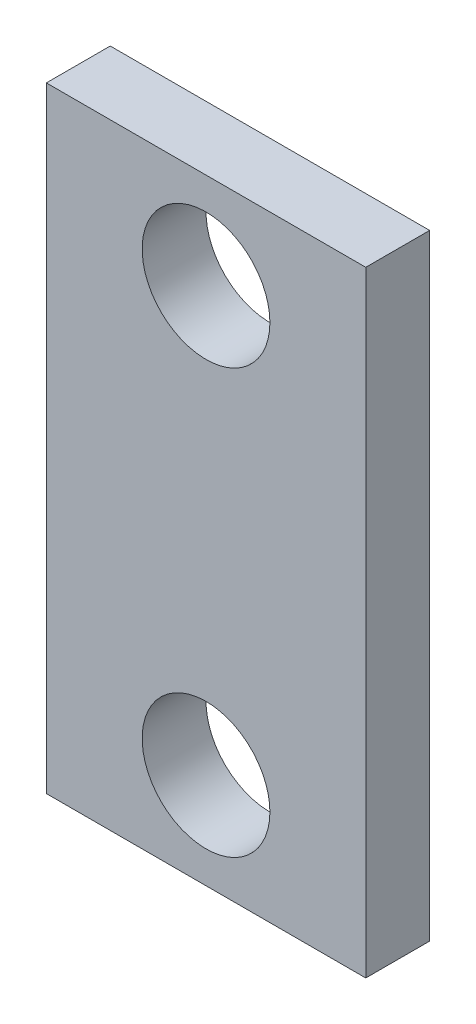
ISO-10303-21;
HEADER;
FILE_DESCRIPTION(('STEP AP214'),'2;1');
FILE_NAME('part.step','',(''),(''),'','','');
FILE_SCHEMA(('AUTOMOTIVE_DESIGN { 1 0 10303 214 1 1 1 1 }'));
ENDSEC;
DATA;
#1=APPLICATION_CONTEXT('core data for automotive mechanical design processes');
#2=APPLICATION_PROTOCOL_DEFINITION('international standard','automotive_design',2000,#1);
#3=PRODUCT_CONTEXT('',#1,'mechanical');
#4=PRODUCT('Part','Part','',(#3));
#5=PRODUCT_RELATED_PRODUCT_CATEGORY('part','',(#4));
#6=PRODUCT_DEFINITION_FORMATION('','',#4);
#7=PRODUCT_DEFINITION_CONTEXT('part definition',#1,'design');
#8=PRODUCT_DEFINITION('design','',#6,#7);
#9=PRODUCT_DEFINITION_SHAPE('','',#8);
#10=(LENGTH_UNIT() NAMED_UNIT(*) SI_UNIT(.MILLI.,.METRE.));
#11=(NAMED_UNIT(*) PLANE_ANGLE_UNIT() SI_UNIT($,.RADIAN.));
#12=(NAMED_UNIT(*) SI_UNIT($,.STERADIAN.) SOLID_ANGLE_UNIT());
#13=UNCERTAINTY_MEASURE_WITH_UNIT(LENGTH_MEASURE(1.E-05),#10,'distance_accuracy_value','');
#14=(GEOMETRIC_REPRESENTATION_CONTEXT(3) GLOBAL_UNCERTAINTY_ASSIGNED_CONTEXT((#13)) GLOBAL_UNIT_ASSIGNED_CONTEXT((#10,
#11,#12)) REPRESENTATION_CONTEXT('',''));
#15=CARTESIAN_POINT('',(0.,0.,0.));
#16=DIRECTION('',(0.,0.,1.));
#17=DIRECTION('',(1.,0.,0.));
#18=AXIS2_PLACEMENT_3D('',#15,#16,#17);
#19=CARTESIAN_POINT('',(0.,0.,2.));
#20=DIRECTION('',(0.,0.,-1.));
#21=DIRECTION('',(-1.,0.,0.));
#22=AXIS2_PLACEMENT_3D('',#19,#20,#21);
#23=PLANE('',#22);
#24=DIRECTION('',(1.,0.,0.));
#25=VECTOR('',#24,1.);
#26=CARTESIAN_POINT('',(10.,0.,2.));
#27=LINE('',#26,#25);
#28=CARTESIAN_POINT('',(0.,0.,2.));
#29=VERTEX_POINT('',#28);
#30=CARTESIAN_POINT('',(10.,0.,2.));
#31=VERTEX_POINT('',#30);
#32=EDGE_CURVE('E98',#29,#31,#27,.T.);
#33=ORIENTED_EDGE('',*,*,#32,.T.);
#34=DIRECTION('',(0.,1.,0.));
#35=VECTOR('',#34,1.);
#36=CARTESIAN_POINT('',(10.,19.27,2.));
#37=LINE('',#36,#35);
#38=CARTESIAN_POINT('',(10.,19.27,2.));
#39=VERTEX_POINT('',#38);
#40=EDGE_CURVE('E93',#31,#39,#37,.T.);
#41=ORIENTED_EDGE('',*,*,#40,.T.);
#42=DIRECTION('',(-1.,0.,0.));
#43=VECTOR('',#42,1.);
#44=CARTESIAN_POINT('',(0.,19.27,2.));
#45=LINE('',#44,#43);
#46=CARTESIAN_POINT('',(0.,19.27,2.));
#47=VERTEX_POINT('',#46);
#48=EDGE_CURVE('E96',#39,#47,#45,.T.);
#49=ORIENTED_EDGE('',*,*,#48,.T.);
#50=DIRECTION('',(0.,-1.,0.));
#51=VECTOR('',#50,1.);
#52=CARTESIAN_POINT('',(0.,0.,2.));
#53=LINE('',#52,#51);
#54=EDGE_CURVE('E63',#47,#29,#53,.T.);
#55=ORIENTED_EDGE('',*,*,#54,.T.);
#56=EDGE_LOOP('',(#33,#41,#49,#55));
#57=FACE_BOUND('',#56,.T.);
#58=CARTESIAN_POINT('',(4.99907778331021,16.27,2.));
#59=DIRECTION('',(0.,0.,1.));
#60=DIRECTION('',(1.,0.,0.));
#61=AXIS2_PLACEMENT_3D('',#58,#59,#60);
#62=CIRCLE('',#61,2.);
#63=CARTESIAN_POINT('',(6.99907778331021,16.27,2.));
#64=VERTEX_POINT('',#63);
#65=EDGE_CURVE('E118',#64,#64,#62,.T.);
#66=ORIENTED_EDGE('',*,*,#65,.F.);
#67=EDGE_LOOP('',(#66));
#68=FACE_BOUND('',#67,.T.);
#69=CARTESIAN_POINT('',(4.99907778331021,3.,2.));
#70=DIRECTION('',(0.,0.,1.));
#71=DIRECTION('',(1.,0.,0.));
#72=AXIS2_PLACEMENT_3D('',#69,#70,#71);
#73=CIRCLE('',#72,2.);
#74=CARTESIAN_POINT('',(6.99907778331021,3.,2.));
#75=VERTEX_POINT('',#74);
#76=EDGE_CURVE('E140',#75,#75,#73,.T.);
#77=ORIENTED_EDGE('',*,*,#76,.F.);
#78=EDGE_LOOP('',(#77));
#79=FACE_BOUND('',#78,.T.);
#80=ADVANCED_FACE('F45',(#57,#68,#79),#23,.F.);
#81=CARTESIAN_POINT('',(0.,0.,0.));
#82=DIRECTION('',(0.,0.,-1.));
#83=DIRECTION('',(-1.,0.,0.));
#84=AXIS2_PLACEMENT_3D('',#81,#82,#83);
#85=PLANE('',#84);
#86=CARTESIAN_POINT('',(4.99907778331021,16.27,0.));
#87=DIRECTION('',(0.,0.,1.));
#88=DIRECTION('',(1.,0.,0.));
#89=AXIS2_PLACEMENT_3D('',#86,#87,#88);
#90=CIRCLE('',#89,2.);
#91=CARTESIAN_POINT('',(6.99907778331021,16.27,0.));
#92=VERTEX_POINT('',#91);
#93=EDGE_CURVE('E136',#92,#92,#90,.T.);
#94=ORIENTED_EDGE('',*,*,#93,.T.);
#95=EDGE_LOOP('',(#94));
#96=FACE_BOUND('',#95,.T.);
#97=DIRECTION('',(1.,0.,0.));
#98=VECTOR('',#97,1.);
#99=CARTESIAN_POINT('',(10.,0.,0.));
#100=LINE('',#99,#98);
#101=CARTESIAN_POINT('',(0.,0.,0.));
#102=VERTEX_POINT('',#101);
#103=CARTESIAN_POINT('',(10.,0.,0.));
#104=VERTEX_POINT('',#103);
#105=EDGE_CURVE('E114',#102,#104,#100,.T.);
#106=ORIENTED_EDGE('',*,*,#105,.F.);
#107=DIRECTION('',(0.,-1.,0.));
#108=VECTOR('',#107,1.);
#109=CARTESIAN_POINT('',(0.,0.,0.));
#110=LINE('',#109,#108);
#111=CARTESIAN_POINT('',(0.,19.27,0.));
#112=VERTEX_POINT('',#111);
#113=EDGE_CURVE('E86',#112,#102,#110,.T.);
#114=ORIENTED_EDGE('',*,*,#113,.F.);
#115=DIRECTION('',(-1.,0.,0.));
#116=VECTOR('',#115,1.);
#117=CARTESIAN_POINT('',(0.,19.27,0.));
#118=LINE('',#117,#116);
#119=CARTESIAN_POINT('',(10.,19.27,0.));
#120=VERTEX_POINT('',#119);
#121=EDGE_CURVE('E80',#120,#112,#118,.T.);
#122=ORIENTED_EDGE('',*,*,#121,.F.);
#123=DIRECTION('',(0.,1.,0.));
#124=VECTOR('',#123,1.);
#125=CARTESIAN_POINT('',(10.,19.27,0.));
#126=LINE('',#125,#124);
#127=EDGE_CURVE('E103',#104,#120,#126,.T.);
#128=ORIENTED_EDGE('',*,*,#127,.F.);
#129=EDGE_LOOP('',(#106,#114,#122,#128));
#130=FACE_BOUND('',#129,.T.);
#131=CARTESIAN_POINT('',(4.99907778331021,3.,0.));
#132=DIRECTION('',(0.,0.,1.));
#133=DIRECTION('',(1.,0.,0.));
#134=AXIS2_PLACEMENT_3D('',#131,#132,#133);
#135=CIRCLE('',#134,2.);
#136=CARTESIAN_POINT('',(6.99907778331021,3.,0.));
#137=VERTEX_POINT('',#136);
#138=EDGE_CURVE('E144',#137,#137,#135,.T.);
#139=ORIENTED_EDGE('',*,*,#138,.T.);
#140=EDGE_LOOP('',(#139));
#141=FACE_BOUND('',#140,.T.);
#142=ADVANCED_FACE('F131',(#96,#130,#141),#85,.T.);
#143=CARTESIAN_POINT('',(10.,0.,2.));
#144=DIRECTION('',(0.,1.,0.));
#145=DIRECTION('',(-1.,0.,0.));
#146=AXIS2_PLACEMENT_3D('',#143,#144,#145);
#147=PLANE('',#146);
#148=ORIENTED_EDGE('',*,*,#105,.T.);
#149=DIRECTION('',(0.,0.,-1.));
#150=VECTOR('',#149,1.);
#151=CARTESIAN_POINT('',(10.,0.,2.));
#152=LINE('',#151,#150);
#153=EDGE_CURVE('E11',#31,#104,#152,.T.);
#154=ORIENTED_EDGE('',*,*,#153,.F.);
#155=ORIENTED_EDGE('',*,*,#32,.F.);
#156=DIRECTION('',(0.,0.,-1.));
#157=VECTOR('',#156,1.);
#158=CARTESIAN_POINT('',(0.,0.,2.));
#159=LINE('',#158,#157);
#160=EDGE_CURVE('E110',#29,#102,#159,.T.);
#161=ORIENTED_EDGE('',*,*,#160,.T.);
#162=EDGE_LOOP('',(#148,#154,#155,#161));
#163=FACE_BOUND('',#162,.T.);
#164=ADVANCED_FACE('F47',(#163),#147,.F.);
#165=CARTESIAN_POINT('',(10.,19.27,2.));
#166=DIRECTION('',(-1.,0.,0.));
#167=DIRECTION('',(0.,-1.,0.));
#168=AXIS2_PLACEMENT_3D('',#165,#166,#167);
#169=PLANE('',#168);
#170=ORIENTED_EDGE('',*,*,#127,.T.);
#171=DIRECTION('',(0.,0.,-1.));
#172=VECTOR('',#171,1.);
#173=CARTESIAN_POINT('',(10.,19.27,2.));
#174=LINE('',#173,#172);
#175=EDGE_CURVE('E55',#39,#120,#174,.T.);
#176=ORIENTED_EDGE('',*,*,#175,.F.);
#177=ORIENTED_EDGE('',*,*,#40,.F.);
#178=ORIENTED_EDGE('',*,*,#153,.T.);
#179=EDGE_LOOP('',(#170,#176,#177,#178));
#180=FACE_BOUND('',#179,.T.);
#181=ADVANCED_FACE('F102',(#180),#169,.F.);
#182=CARTESIAN_POINT('',(0.,19.27,2.));
#183=DIRECTION('',(0.,-1.,0.));
#184=DIRECTION('',(0.,0.,-1.));
#185=AXIS2_PLACEMENT_3D('',#182,#183,#184);
#186=PLANE('',#185);
#187=ORIENTED_EDGE('',*,*,#121,.T.);
#188=DIRECTION('',(0.,0.,-1.));
#189=VECTOR('',#188,1.);
#190=CARTESIAN_POINT('',(0.,19.27,2.));
#191=LINE('',#190,#189);
#192=EDGE_CURVE('E105',#47,#112,#191,.T.);
#193=ORIENTED_EDGE('',*,*,#192,.F.);
#194=ORIENTED_EDGE('',*,*,#48,.F.);
#195=ORIENTED_EDGE('',*,*,#175,.T.);
#196=EDGE_LOOP('',(#187,#193,#194,#195));
#197=FACE_BOUND('',#196,.T.);
#198=ADVANCED_FACE('F106',(#197),#186,.F.);
#199=CARTESIAN_POINT('',(0.,0.,2.));
#200=DIRECTION('',(1.,0.,0.));
#201=DIRECTION('',(0.,0.,-1.));
#202=AXIS2_PLACEMENT_3D('',#199,#200,#201);
#203=PLANE('',#202);
#204=ORIENTED_EDGE('',*,*,#113,.T.);
#205=ORIENTED_EDGE('',*,*,#160,.F.);
#206=ORIENTED_EDGE('',*,*,#54,.F.);
#207=ORIENTED_EDGE('',*,*,#192,.T.);
#208=EDGE_LOOP('',(#204,#205,#206,#207));
#209=FACE_BOUND('',#208,.T.);
#210=ADVANCED_FACE('F128',(#209),#203,.F.);
#211=CARTESIAN_POINT('',(4.99907778331021,16.27,2.));
#212=DIRECTION('',(0.,0.,-1.));
#213=DIRECTION('',(-1.,0.,0.));
#214=AXIS2_PLACEMENT_3D('',#211,#212,#213);
#215=CYLINDRICAL_SURFACE('',#214,2.);
#216=ORIENTED_EDGE('',*,*,#65,.T.);
#217=EDGE_LOOP('',(#216));
#218=FACE_BOUND('',#217,.T.);
#219=ORIENTED_EDGE('',*,*,#93,.F.);
#220=EDGE_LOOP('',(#219));
#221=FACE_BOUND('',#220,.T.);
#222=ADVANCED_FACE('F163',(#218,#221),#215,.F.);
#223=CARTESIAN_POINT('',(4.99907778331021,3.,2.));
#224=DIRECTION('',(0.,0.,-1.));
#225=DIRECTION('',(-1.,0.,0.));
#226=AXIS2_PLACEMENT_3D('',#223,#224,#225);
#227=CYLINDRICAL_SURFACE('',#226,2.);
#228=ORIENTED_EDGE('',*,*,#76,.T.);
#229=EDGE_LOOP('',(#228));
#230=FACE_BOUND('',#229,.T.);
#231=ORIENTED_EDGE('',*,*,#138,.F.);
#232=EDGE_LOOP('',(#231));
#233=FACE_BOUND('',#232,.T.);
#234=ADVANCED_FACE('F152',(#230,#233),#227,.F.);
#235=CLOSED_SHELL('',(#80,#142,#164,#181,#198,#210,#222,#234));
#236=MANIFOLD_SOLID_BREP('B2',#235);
#237=ADVANCED_BREP_SHAPE_REPRESENTATION('',(#18,#236),#14);
#238=SHAPE_DEFINITION_REPRESENTATION(#9,#237);
ENDSEC;
END-ISO-10303-21;
